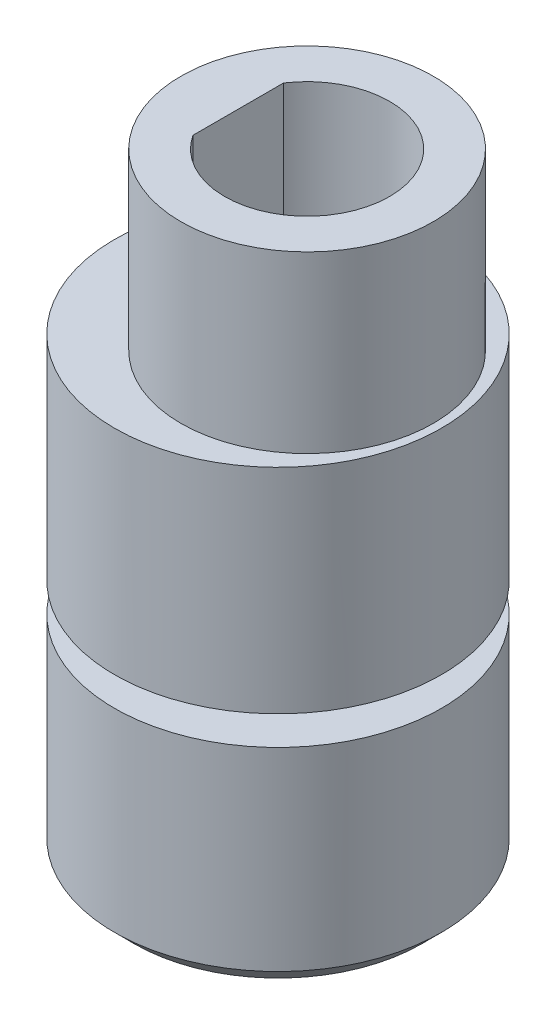
ISO-10303-21;
HEADER;
FILE_DESCRIPTION(('STEP AP214'),'2;1');
FILE_NAME('part.step','',(''),(''),'','','');
FILE_SCHEMA(('AUTOMOTIVE_DESIGN { 1 0 10303 214 1 1 1 1 }'));
ENDSEC;
DATA;
#1=APPLICATION_CONTEXT('core data for automotive mechanical design processes');
#2=APPLICATION_PROTOCOL_DEFINITION('international standard','automotive_design',2000,#1);
#3=PRODUCT_CONTEXT('',#1,'mechanical');
#4=PRODUCT('Part','Part','',(#3));
#5=PRODUCT_RELATED_PRODUCT_CATEGORY('part','',(#4));
#6=PRODUCT_DEFINITION_FORMATION('','',#4);
#7=PRODUCT_DEFINITION_CONTEXT('part definition',#1,'design');
#8=PRODUCT_DEFINITION('design','',#6,#7);
#9=PRODUCT_DEFINITION_SHAPE('','',#8);
#10=(LENGTH_UNIT() NAMED_UNIT(*) SI_UNIT(.MILLI.,.METRE.));
#11=(NAMED_UNIT(*) PLANE_ANGLE_UNIT() SI_UNIT($,.RADIAN.));
#12=(NAMED_UNIT(*) SI_UNIT($,.STERADIAN.) SOLID_ANGLE_UNIT());
#13=UNCERTAINTY_MEASURE_WITH_UNIT(LENGTH_MEASURE(1.E-05),#10,'distance_accuracy_value','');
#14=(GEOMETRIC_REPRESENTATION_CONTEXT(3) GLOBAL_UNCERTAINTY_ASSIGNED_CONTEXT((#13)) GLOBAL_UNIT_ASSIGNED_CONTEXT((#10,
#11,#12)) REPRESENTATION_CONTEXT('',''));
#15=CARTESIAN_POINT('',(0.,0.,0.));
#16=DIRECTION('',(0.,0.,1.));
#17=DIRECTION('',(1.,0.,0.));
#18=AXIS2_PLACEMENT_3D('',#15,#16,#17);
#19=CARTESIAN_POINT('',(1.5,11.,0.));
#20=DIRECTION('',(0.,-1.,0.));
#21=DIRECTION('',(0.,0.,-1.));
#22=AXIS2_PLACEMENT_3D('',#19,#20,#21);
#23=CYLINDRICAL_SURFACE('',#22,4.25);
#24=CARTESIAN_POINT('',(1.5,-3.,0.));
#25=DIRECTION('',(0.,-1.,0.));
#26=DIRECTION('',(0.,0.,-1.));
#27=AXIS2_PLACEMENT_3D('',#24,#25,#26);
#28=CIRCLE('',#27,4.25);
#29=CARTESIAN_POINT('',(-2.05,-3.,-2.33666428910959));
#30=VERTEX_POINT('',#29);
#31=CARTESIAN_POINT('',(-2.05,-3.,2.33666428910959));
#32=VERTEX_POINT('',#31);
#33=EDGE_CURVE('E49',#30,#32,#28,.T.);
#34=ORIENTED_EDGE('',*,*,#33,.T.);
#35=DIRECTION('',(0.,-1.,0.));
#36=VECTOR('',#35,1.);
#37=CARTESIAN_POINT('',(-2.05,15.7254629402843,2.33666428910959));
#38=LINE('',#37,#36);
#39=CARTESIAN_POINT('',(-2.05,20.,2.33666428910959));
#40=VERTEX_POINT('',#39);
#41=EDGE_CURVE('E76',#40,#32,#38,.T.);
#42=ORIENTED_EDGE('',*,*,#41,.F.);
#43=CARTESIAN_POINT('',(1.5,20.,0.));
#44=DIRECTION('',(0.,1.,0.));
#45=DIRECTION('',(0.,0.,1.));
#46=AXIS2_PLACEMENT_3D('',#43,#44,#45);
#47=CIRCLE('',#46,4.25);
#48=CARTESIAN_POINT('',(-2.05,20.,-2.33666428910959));
#49=VERTEX_POINT('',#48);
#50=EDGE_CURVE('E72',#40,#49,#47,.T.);
#51=ORIENTED_EDGE('',*,*,#50,.T.);
#52=DIRECTION('',(0.,-1.,0.));
#53=VECTOR('',#52,1.);
#54=CARTESIAN_POINT('',(-2.05,15.7254629402843,-2.33666428910959));
#55=LINE('',#54,#53);
#56=EDGE_CURVE('E78',#49,#30,#55,.T.);
#57=ORIENTED_EDGE('',*,*,#56,.T.);
#58=EDGE_LOOP('',(#34,#42,#51,#57));
#59=FACE_BOUND('',#58,.T.);
#60=ADVANCED_FACE('F33',(#59),#23,.F.);
#61=CARTESIAN_POINT('',(-2.05,15.7254629402843,2.33666428910959));
#62=DIRECTION('',(1.,0.,0.));
#63=DIRECTION('',(0.,0.,-1.));
#64=AXIS2_PLACEMENT_3D('',#61,#62,#63);
#65=PLANE('',#64);
#66=ORIENTED_EDGE('',*,*,#41,.T.);
#67=DIRECTION('',(0.,0.,-1.));
#68=VECTOR('',#67,1.);
#69=CARTESIAN_POINT('',(-2.05,-3.,-2.33666428910958));
#70=LINE('',#69,#68);
#71=EDGE_CURVE('E67',#32,#30,#70,.T.);
#72=ORIENTED_EDGE('',*,*,#71,.T.);
#73=ORIENTED_EDGE('',*,*,#56,.F.);
#74=DIRECTION('',(0.,0.,1.));
#75=VECTOR('',#74,1.);
#76=CARTESIAN_POINT('',(-2.05,20.,-2.33666428910959));
#77=LINE('',#76,#75);
#78=EDGE_CURVE('E82',#49,#40,#77,.T.);
#79=ORIENTED_EDGE('',*,*,#78,.T.);
#80=EDGE_LOOP('',(#66,#72,#73,#79));
#81=FACE_BOUND('',#80,.T.);
#82=ADVANCED_FACE('F80',(#81),#65,.T.);
#83=CARTESIAN_POINT('',(0.,11.,0.));
#84=DIRECTION('',(0.,-1.,0.));
#85=DIRECTION('',(0.,0.,-1.));
#86=AXIS2_PLACEMENT_3D('',#83,#84,#85);
#87=CYLINDRICAL_SURFACE('',#86,8.425);
#88=CARTESIAN_POINT('',(0.,11.,0.));
#89=DIRECTION('',(0.,1.,0.));
#90=DIRECTION('',(0.,0.,1.));
#91=AXIS2_PLACEMENT_3D('',#88,#89,#90);
#92=CIRCLE('',#91,8.425);
#93=CARTESIAN_POINT('',(0.,11.,8.425));
#94=VERTEX_POINT('',#93);
#95=EDGE_CURVE('E94',#94,#94,#92,.T.);
#96=ORIENTED_EDGE('',*,*,#95,.F.);
#97=EDGE_LOOP('',(#96));
#98=FACE_BOUND('',#97,.T.);
#99=CARTESIAN_POINT('',(0.,0.,0.));
#100=DIRECTION('',(0.,1.,0.));
#101=DIRECTION('',(0.,0.,1.));
#102=AXIS2_PLACEMENT_3D('',#99,#100,#101);
#103=CIRCLE('',#102,8.425);
#104=CARTESIAN_POINT('',(6.65997567676889,0.,-5.1599756767689));
#105=VERTEX_POINT('',#104);
#106=CARTESIAN_POINT('',(-5.1599756767689,0.,6.65997567676889));
#107=VERTEX_POINT('',#106);
#108=EDGE_CURVE('E97',#105,#107,#103,.T.);
#109=ORIENTED_EDGE('',*,*,#108,.T.);
#110=EDGE_CURVE('E93',#107,#105,#103,.T.);
#111=ORIENTED_EDGE('',*,*,#110,.T.);
#112=EDGE_LOOP('',(#109,#111));
#113=FACE_BOUND('',#112,.T.);
#114=ADVANCED_FACE('F131',(#98,#113),#87,.T.);
#115=CARTESIAN_POINT('',(0.,11.,0.));
#116=DIRECTION('',(0.,1.,0.));
#117=DIRECTION('',(0.,0.,1.));
#118=AXIS2_PLACEMENT_3D('',#115,#116,#117);
#119=PLANE('',#118);
#120=CARTESIAN_POINT('',(1.5,11.,0.));
#121=DIRECTION('',(0.,1.,0.));
#122=DIRECTION('',(0.,0.,1.));
#123=AXIS2_PLACEMENT_3D('',#120,#121,#122);
#124=CIRCLE('',#123,6.5);
#125=CARTESIAN_POINT('',(1.5,11.,6.5));
#126=VERTEX_POINT('',#125);
#127=EDGE_CURVE('E11',#126,#126,#124,.T.);
#128=ORIENTED_EDGE('',*,*,#127,.F.);
#129=EDGE_LOOP('',(#128));
#130=FACE_BOUND('',#129,.T.);
#131=ORIENTED_EDGE('',*,*,#95,.T.);
#132=EDGE_LOOP('',(#131));
#133=FACE_BOUND('',#132,.T.);
#134=ADVANCED_FACE('F198',(#130,#133),#119,.T.);
#135=CARTESIAN_POINT('',(0.,0.,0.));
#136=DIRECTION('',(0.,1.,0.));
#137=DIRECTION('',(0.,0.,1.));
#138=AXIS2_PLACEMENT_3D('',#135,#136,#137);
#139=PLANE('',#138);
#140=CARTESIAN_POINT('',(1.5,0.,1.5));
#141=DIRECTION('',(0.,-1.,0.));
#142=DIRECTION('',(0.,0.,-1.));
#143=AXIS2_PLACEMENT_3D('',#140,#141,#142);
#144=CIRCLE('',#143,8.425);
#145=EDGE_CURVE('E56',#107,#105,#144,.T.);
#146=ORIENTED_EDGE('',*,*,#145,.F.);
#147=ORIENTED_EDGE('',*,*,#108,.F.);
#148=EDGE_LOOP('',(#146,#147));
#149=FACE_BOUND('',#148,.T.);
#150=ADVANCED_FACE('F123',(#149),#139,.F.);
#151=CARTESIAN_POINT('',(1.5,-11.,1.5));
#152=DIRECTION('',(0.,1.,0.));
#153=DIRECTION('',(0.,0.,1.));
#154=AXIS2_PLACEMENT_3D('',#151,#152,#153);
#155=CYLINDRICAL_SURFACE('',#154,8.425);
#156=CARTESIAN_POINT('',(1.5,-10.,1.5));
#157=DIRECTION('',(0.,-1.,0.));
#158=DIRECTION('',(0.,0.,-1.));
#159=AXIS2_PLACEMENT_3D('',#156,#157,#158);
#160=CIRCLE('',#159,8.425);
#161=CARTESIAN_POINT('',(1.5,-10.,-6.925));
#162=VERTEX_POINT('',#161);
#163=EDGE_CURVE('E42',#162,#162,#160,.F.);
#164=ORIENTED_EDGE('',*,*,#163,.T.);
#165=EDGE_LOOP('',(#164));
#166=FACE_BOUND('',#165,.T.);
#167=EDGE_CURVE('E86',#105,#107,#144,.T.);
#168=ORIENTED_EDGE('',*,*,#167,.T.);
#169=ORIENTED_EDGE('',*,*,#145,.T.);
#170=EDGE_LOOP('',(#168,#169));
#171=FACE_BOUND('',#170,.T.);
#172=ADVANCED_FACE('F104',(#166,#171),#155,.T.);
#173=CARTESIAN_POINT('',(1.5,-11.,1.5));
#174=DIRECTION('',(0.,-1.,0.));
#175=DIRECTION('',(0.,0.,-1.));
#176=AXIS2_PLACEMENT_3D('',#173,#174,#175);
#177=PLANE('',#176);
#178=CARTESIAN_POINT('',(1.53453766306404,-11.,0.));
#179=DIRECTION('',(0.,-1.,0.));
#180=DIRECTION('',(0.,0.,-1.));
#181=AXIS2_PLACEMENT_3D('',#178,#179,#180);
#182=CIRCLE('',#181,1.10406536706658);
#183=CARTESIAN_POINT('',(1.53453766306404,-11.,-1.10406536706658));
#184=VERTEX_POINT('',#183);
#185=EDGE_CURVE('E151',#184,#184,#182,.T.);
#186=ORIENTED_EDGE('',*,*,#185,.F.);
#187=EDGE_LOOP('',(#186));
#188=FACE_BOUND('',#187,.T.);
#189=CARTESIAN_POINT('',(1.5,-11.,1.5));
#190=DIRECTION('',(0.,-1.,0.));
#191=DIRECTION('',(0.,0.,-1.));
#192=AXIS2_PLACEMENT_3D('',#189,#190,#191);
#193=CIRCLE('',#192,7.425);
#194=CARTESIAN_POINT('',(1.5,-11.,-5.925));
#195=VERTEX_POINT('',#194);
#196=EDGE_CURVE('E99',#195,#195,#193,.T.);
#197=ORIENTED_EDGE('',*,*,#196,.T.);
#198=EDGE_LOOP('',(#197));
#199=FACE_BOUND('',#198,.T.);
#200=ADVANCED_FACE('F113',(#188,#199),#177,.T.);
#201=CARTESIAN_POINT('',(1.5,0.,1.5));
#202=DIRECTION('',(0.,-1.,0.));
#203=DIRECTION('',(0.,0.,-1.));
#204=AXIS2_PLACEMENT_3D('',#201,#202,#203);
#205=PLANE('',#204);
#206=ORIENTED_EDGE('',*,*,#110,.F.);
#207=ORIENTED_EDGE('',*,*,#167,.F.);
#208=EDGE_LOOP('',(#206,#207));
#209=FACE_BOUND('',#208,.T.);
#210=ADVANCED_FACE('F110',(#209),#205,.F.);
#211=CARTESIAN_POINT('',(1.5,-11.,1.5));
#212=DIRECTION('',(0.,1.,0.));
#213=DIRECTION('',(0.,0.,1.));
#214=AXIS2_PLACEMENT_3D('',#211,#212,#213);
#215=CONICAL_SURFACE('',#214,7.425,0.785398163397447);
#216=ORIENTED_EDGE('',*,*,#163,.F.);
#217=EDGE_LOOP('',(#216));
#218=FACE_BOUND('',#217,.T.);
#219=ORIENTED_EDGE('',*,*,#196,.F.);
#220=EDGE_LOOP('',(#219));
#221=FACE_BOUND('',#220,.T.);
#222=ADVANCED_FACE('F35',(#218,#221),#215,.T.);
#223=CARTESIAN_POINT('',(1.5,20.,0.));
#224=DIRECTION('',(0.,1.,0.));
#225=DIRECTION('',(0.,0.,1.));
#226=AXIS2_PLACEMENT_3D('',#223,#224,#225);
#227=PLANE('',#226);
#228=CARTESIAN_POINT('',(1.5,20.,0.));
#229=DIRECTION('',(0.,1.,0.));
#230=DIRECTION('',(0.,0.,1.));
#231=AXIS2_PLACEMENT_3D('',#228,#229,#230);
#232=CIRCLE('',#231,6.5);
#233=CARTESIAN_POINT('',(1.5,20.,6.5));
#234=VERTEX_POINT('',#233);
#235=EDGE_CURVE('E84',#234,#234,#232,.T.);
#236=ORIENTED_EDGE('',*,*,#235,.T.);
#237=EDGE_LOOP('',(#236));
#238=FACE_BOUND('',#237,.T.);
#239=ORIENTED_EDGE('',*,*,#78,.F.);
#240=ORIENTED_EDGE('',*,*,#50,.F.);
#241=EDGE_LOOP('',(#239,#240));
#242=FACE_BOUND('',#241,.T.);
#243=ADVANCED_FACE('F109',(#238,#242),#227,.T.);
#244=CARTESIAN_POINT('',(1.5,20.,0.));
#245=DIRECTION('',(0.,-1.,0.));
#246=DIRECTION('',(0.,0.,-1.));
#247=AXIS2_PLACEMENT_3D('',#244,#245,#246);
#248=CYLINDRICAL_SURFACE('',#247,6.5);
#249=ORIENTED_EDGE('',*,*,#235,.F.);
#250=EDGE_LOOP('',(#249));
#251=FACE_BOUND('',#250,.T.);
#252=ORIENTED_EDGE('',*,*,#127,.T.);
#253=EDGE_LOOP('',(#252));
#254=FACE_BOUND('',#253,.T.);
#255=ADVANCED_FACE('F134',(#251,#254),#248,.T.);
#256=CARTESIAN_POINT('',(1.5,-3.,0.));
#257=DIRECTION('',(0.,-1.,0.));
#258=DIRECTION('',(0.,0.,-1.));
#259=AXIS2_PLACEMENT_3D('',#256,#257,#258);
#260=PLANE('',#259);
#261=CARTESIAN_POINT('',(1.53453766306404,-3.,0.));
#262=DIRECTION('',(0.,-1.,0.));
#263=DIRECTION('',(0.,0.,-1.));
#264=AXIS2_PLACEMENT_3D('',#261,#262,#263);
#265=CIRCLE('',#264,1.10406536706658);
#266=CARTESIAN_POINT('',(1.53453766306404,-3.,-1.10406536706658));
#267=VERTEX_POINT('',#266);
#268=EDGE_CURVE('E37',#267,#267,#265,.T.);
#269=ORIENTED_EDGE('',*,*,#268,.T.);
#270=EDGE_LOOP('',(#269));
#271=FACE_BOUND('',#270,.T.);
#272=ORIENTED_EDGE('',*,*,#33,.F.);
#273=ORIENTED_EDGE('',*,*,#71,.F.);
#274=EDGE_LOOP('',(#272,#273));
#275=FACE_BOUND('',#274,.T.);
#276=ADVANCED_FACE('F68',(#271,#275),#260,.F.);
#277=CARTESIAN_POINT('',(1.53453766306404,20.,0.));
#278=DIRECTION('',(0.,-1.,0.));
#279=DIRECTION('',(0.,0.,-1.));
#280=AXIS2_PLACEMENT_3D('',#277,#278,#279);
#281=CYLINDRICAL_SURFACE('',#280,1.10406536706658);
#282=ORIENTED_EDGE('',*,*,#185,.T.);
#283=EDGE_LOOP('',(#282));
#284=FACE_BOUND('',#283,.T.);
#285=ORIENTED_EDGE('',*,*,#268,.F.);
#286=EDGE_LOOP('',(#285));
#287=FACE_BOUND('',#286,.T.);
#288=ADVANCED_FACE('F143',(#284,#287),#281,.F.);
#289=CLOSED_SHELL('',(#60,#82,#114,#134,#150,#172,#200,#210,#222,#243,#255,#276,#288));
#290=MANIFOLD_SOLID_BREP('B2',#289);
#291=ADVANCED_BREP_SHAPE_REPRESENTATION('',(#18,#290),#14);
#292=SHAPE_DEFINITION_REPRESENTATION(#9,#291);
ENDSEC;
END-ISO-10303-21;
